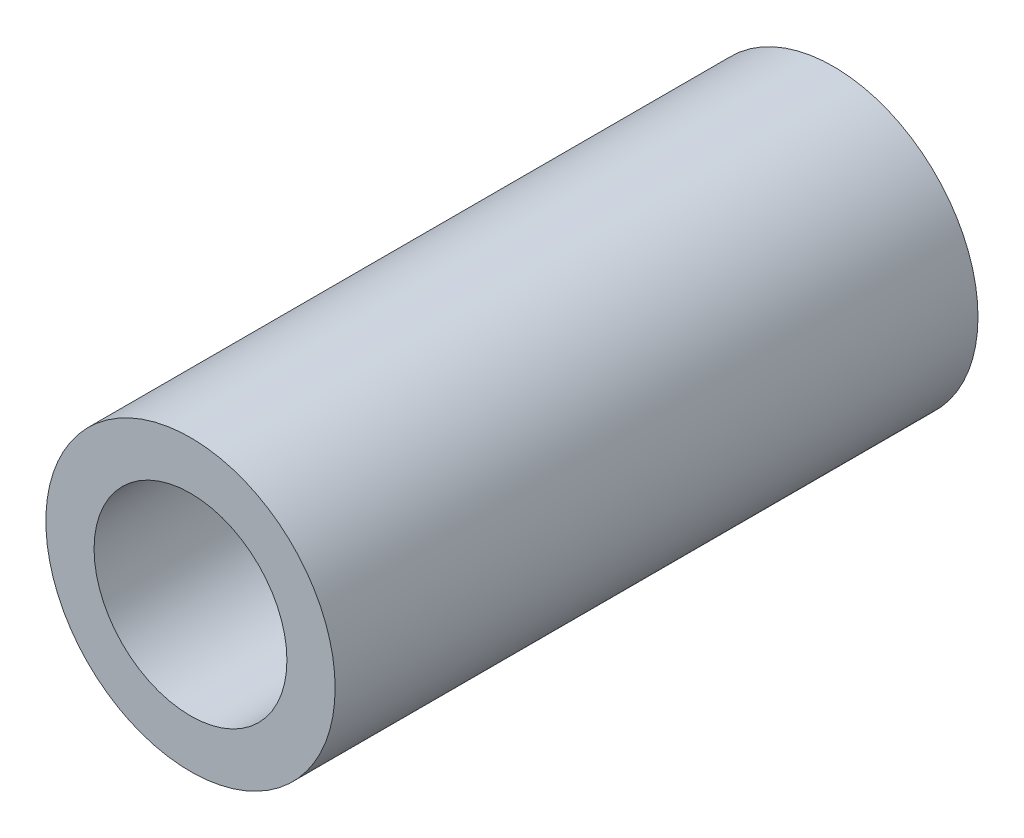
ISO-10303-21;
HEADER;
FILE_DESCRIPTION(('STEP AP214'),'2;1');
FILE_NAME('part.step','',(''),(''),'','','');
FILE_SCHEMA(('AUTOMOTIVE_DESIGN { 1 0 10303 214 1 1 1 1 }'));
ENDSEC;
DATA;
#1=APPLICATION_CONTEXT('core data for automotive mechanical design processes');
#2=APPLICATION_PROTOCOL_DEFINITION('international standard','automotive_design',2000,#1);
#3=PRODUCT_CONTEXT('',#1,'mechanical');
#4=PRODUCT('Part','Part','',(#3));
#5=PRODUCT_RELATED_PRODUCT_CATEGORY('part','',(#4));
#6=PRODUCT_DEFINITION_FORMATION('','',#4);
#7=PRODUCT_DEFINITION_CONTEXT('part definition',#1,'design');
#8=PRODUCT_DEFINITION('design','',#6,#7);
#9=PRODUCT_DEFINITION_SHAPE('','',#8);
#10=(LENGTH_UNIT() NAMED_UNIT(*) SI_UNIT(.MILLI.,.METRE.));
#11=(NAMED_UNIT(*) PLANE_ANGLE_UNIT() SI_UNIT($,.RADIAN.));
#12=(NAMED_UNIT(*) SI_UNIT($,.STERADIAN.) SOLID_ANGLE_UNIT());
#13=UNCERTAINTY_MEASURE_WITH_UNIT(LENGTH_MEASURE(1.E-05),#10,'distance_accuracy_value','');
#14=(GEOMETRIC_REPRESENTATION_CONTEXT(3) GLOBAL_UNCERTAINTY_ASSIGNED_CONTEXT((#13)) GLOBAL_UNIT_ASSIGNED_CONTEXT((#10,
#11,#12)) REPRESENTATION_CONTEXT('',''));
#15=CARTESIAN_POINT('',(0.,0.,0.));
#16=DIRECTION('',(0.,0.,1.));
#17=DIRECTION('',(1.,0.,0.));
#18=AXIS2_PLACEMENT_3D('',#15,#16,#17);
#19=CARTESIAN_POINT('',(0.,0.,20.));
#20=DIRECTION('',(0.,0.,-1.));
#21=DIRECTION('',(-1.,0.,0.));
#22=AXIS2_PLACEMENT_3D('',#19,#20,#21);
#23=CYLINDRICAL_SURFACE('',#22,4.5);
#24=CARTESIAN_POINT('',(0.,0.,20.));
#25=DIRECTION('',(0.,0.,1.));
#26=DIRECTION('',(1.,0.,0.));
#27=AXIS2_PLACEMENT_3D('',#24,#25,#26);
#28=CIRCLE('',#27,4.5);
#29=CARTESIAN_POINT('',(4.5,0.,20.));
#30=VERTEX_POINT('',#29);
#31=EDGE_CURVE('E10',#30,#30,#28,.T.);
#32=ORIENTED_EDGE('',*,*,#31,.F.);
#33=EDGE_LOOP('',(#32));
#34=FACE_BOUND('',#33,.T.);
#35=CARTESIAN_POINT('',(0.,0.,0.));
#36=DIRECTION('',(0.,0.,1.));
#37=DIRECTION('',(1.,0.,0.));
#38=AXIS2_PLACEMENT_3D('',#35,#36,#37);
#39=CIRCLE('',#38,4.5);
#40=CARTESIAN_POINT('',(4.5,0.,0.));
#41=VERTEX_POINT('',#40);
#42=EDGE_CURVE('E38',#41,#41,#39,.T.);
#43=ORIENTED_EDGE('',*,*,#42,.T.);
#44=EDGE_LOOP('',(#43));
#45=FACE_BOUND('',#44,.T.);
#46=ADVANCED_FACE('F35',(#34,#45),#23,.T.);
#47=CARTESIAN_POINT('',(0.,0.,20.));
#48=DIRECTION('',(0.,0.,1.));
#49=DIRECTION('',(1.,0.,0.));
#50=AXIS2_PLACEMENT_3D('',#47,#48,#49);
#51=PLANE('',#50);
#52=CARTESIAN_POINT('',(0.,0.,20.));
#53=DIRECTION('',(0.,0.,-1.));
#54=DIRECTION('',(-1.,0.,0.));
#55=AXIS2_PLACEMENT_3D('',#52,#53,#54);
#56=CIRCLE('',#55,3.);
#57=CARTESIAN_POINT('',(-3.,0.,20.));
#58=VERTEX_POINT('',#57);
#59=EDGE_CURVE('E45',#58,#58,#56,.T.);
#60=ORIENTED_EDGE('',*,*,#59,.T.);
#61=EDGE_LOOP('',(#60));
#62=FACE_BOUND('',#61,.T.);
#63=ORIENTED_EDGE('',*,*,#31,.T.);
#64=EDGE_LOOP('',(#63));
#65=FACE_BOUND('',#64,.T.);
#66=ADVANCED_FACE('F53',(#62,#65),#51,.T.);
#67=CARTESIAN_POINT('',(0.,0.,0.));
#68=DIRECTION('',(0.,0.,1.));
#69=DIRECTION('',(1.,0.,0.));
#70=AXIS2_PLACEMENT_3D('',#67,#68,#69);
#71=PLANE('',#70);
#72=CARTESIAN_POINT('',(0.,0.,0.));
#73=DIRECTION('',(0.,0.,-1.));
#74=DIRECTION('',(-1.,0.,0.));
#75=AXIS2_PLACEMENT_3D('',#72,#73,#74);
#76=CIRCLE('',#75,3.);
#77=CARTESIAN_POINT('',(-3.,0.,0.));
#78=VERTEX_POINT('',#77);
#79=EDGE_CURVE('E47',#78,#78,#76,.T.);
#80=ORIENTED_EDGE('',*,*,#79,.F.);
#81=EDGE_LOOP('',(#80));
#82=FACE_BOUND('',#81,.T.);
#83=ORIENTED_EDGE('',*,*,#42,.F.);
#84=EDGE_LOOP('',(#83));
#85=FACE_BOUND('',#84,.T.);
#86=ADVANCED_FACE('F58',(#82,#85),#71,.F.);
#87=CARTESIAN_POINT('',(0.,0.,20.));
#88=DIRECTION('',(0.,0.,-1.));
#89=DIRECTION('',(-1.,0.,0.));
#90=AXIS2_PLACEMENT_3D('',#87,#88,#89);
#91=CYLINDRICAL_SURFACE('',#90,3.);
#92=ORIENTED_EDGE('',*,*,#59,.F.);
#93=EDGE_LOOP('',(#92));
#94=FACE_BOUND('',#93,.T.);
#95=ORIENTED_EDGE('',*,*,#79,.T.);
#96=EDGE_LOOP('',(#95));
#97=FACE_BOUND('',#96,.T.);
#98=ADVANCED_FACE('F55',(#94,#97),#91,.F.);
#99=CLOSED_SHELL('',(#46,#66,#86,#98));
#100=MANIFOLD_SOLID_BREP('B2',#99);
#101=ADVANCED_BREP_SHAPE_REPRESENTATION('',(#18,#100),#14);
#102=SHAPE_DEFINITION_REPRESENTATION(#9,#101);
ENDSEC;
END-ISO-10303-21;
